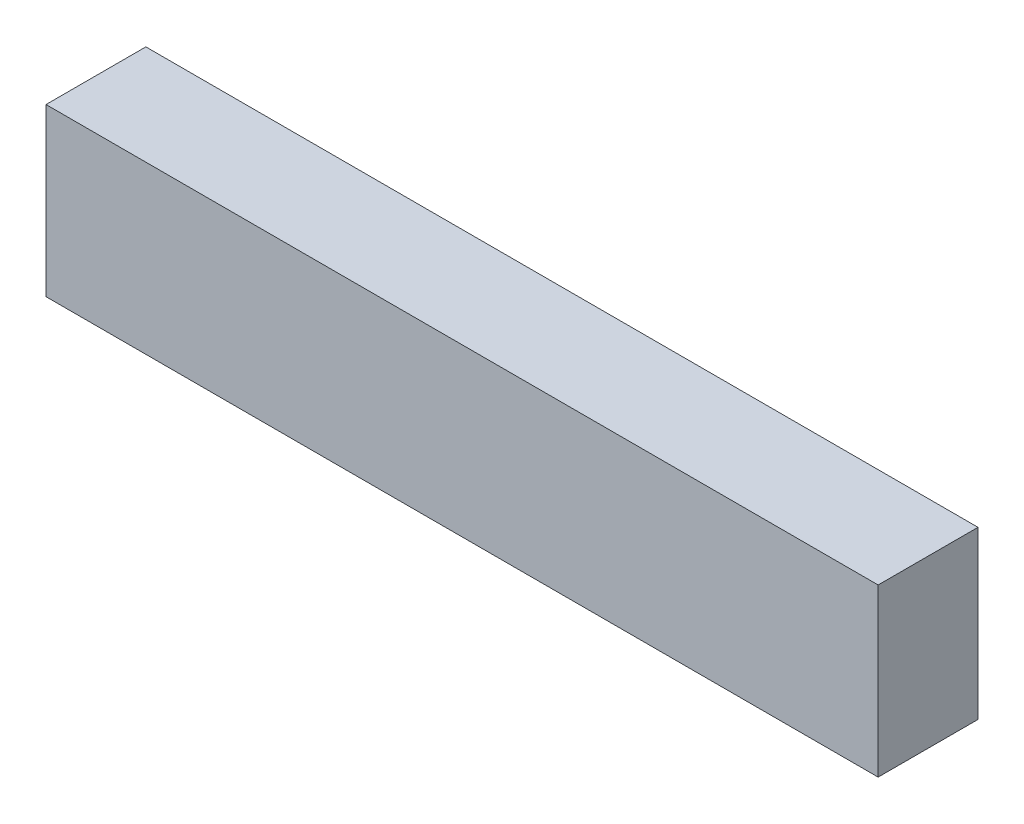
ISO-10303-21;
HEADER;
FILE_DESCRIPTION(('STEP AP214'),'2;1');
FILE_NAME('part.step','',(''),(''),'','','');
FILE_SCHEMA(('AUTOMOTIVE_DESIGN { 1 0 10303 214 1 1 1 1 }'));
ENDSEC;
DATA;
#1=APPLICATION_CONTEXT('core data for automotive mechanical design processes');
#2=APPLICATION_PROTOCOL_DEFINITION('international standard','automotive_design',2000,#1);
#3=PRODUCT_CONTEXT('',#1,'mechanical');
#4=PRODUCT('Part','Part','',(#3));
#5=PRODUCT_RELATED_PRODUCT_CATEGORY('part','',(#4));
#6=PRODUCT_DEFINITION_FORMATION('','',#4);
#7=PRODUCT_DEFINITION_CONTEXT('part definition',#1,'design');
#8=PRODUCT_DEFINITION('design','',#6,#7);
#9=PRODUCT_DEFINITION_SHAPE('','',#8);
#10=(LENGTH_UNIT() NAMED_UNIT(*) SI_UNIT(.MILLI.,.METRE.));
#11=(NAMED_UNIT(*) PLANE_ANGLE_UNIT() SI_UNIT($,.RADIAN.));
#12=(NAMED_UNIT(*) SI_UNIT($,.STERADIAN.) SOLID_ANGLE_UNIT());
#13=UNCERTAINTY_MEASURE_WITH_UNIT(LENGTH_MEASURE(1.E-05),#10,'distance_accuracy_value','');
#14=(GEOMETRIC_REPRESENTATION_CONTEXT(3) GLOBAL_UNCERTAINTY_ASSIGNED_CONTEXT((#13)) GLOBAL_UNIT_ASSIGNED_CONTEXT((#10,
#11,#12)) REPRESENTATION_CONTEXT('',''));
#15=CARTESIAN_POINT('',(0.,0.,0.));
#16=DIRECTION('',(0.,0.,1.));
#17=DIRECTION('',(1.,0.,0.));
#18=AXIS2_PLACEMENT_3D('',#15,#16,#17);
#19=CARTESIAN_POINT('',(0.,0.,6.));
#20=DIRECTION('',(-1.,0.,0.));
#21=DIRECTION('',(0.,0.,1.));
#22=AXIS2_PLACEMENT_3D('',#19,#20,#21);
#23=PLANE('',#22);
#24=DIRECTION('',(0.,1.,0.));
#25=VECTOR('',#24,1.);
#26=CARTESIAN_POINT('',(0.,0.,0.));
#27=LINE('',#26,#25);
#28=CARTESIAN_POINT('',(0.,0.,0.));
#29=VERTEX_POINT('',#28);
#30=CARTESIAN_POINT('',(0.,10.,0.));
#31=VERTEX_POINT('',#30);
#32=EDGE_CURVE('E96',#29,#31,#27,.T.);
#33=ORIENTED_EDGE('',*,*,#32,.T.);
#34=DIRECTION('',(0.,0.,-1.));
#35=VECTOR('',#34,1.);
#36=CARTESIAN_POINT('',(0.,10.,6.));
#37=LINE('',#36,#35);
#38=CARTESIAN_POINT('',(0.,10.,6.));
#39=VERTEX_POINT('',#38);
#40=EDGE_CURVE('E11',#39,#31,#37,.T.);
#41=ORIENTED_EDGE('',*,*,#40,.F.);
#42=DIRECTION('',(0.,1.,0.));
#43=VECTOR('',#42,1.);
#44=CARTESIAN_POINT('',(0.,0.,6.));
#45=LINE('',#44,#43);
#46=CARTESIAN_POINT('',(0.,0.,6.));
#47=VERTEX_POINT('',#46);
#48=EDGE_CURVE('E84',#47,#39,#45,.T.);
#49=ORIENTED_EDGE('',*,*,#48,.F.);
#50=DIRECTION('',(0.,0.,-1.));
#51=VECTOR('',#50,1.);
#52=CARTESIAN_POINT('',(0.,0.,6.));
#53=LINE('',#52,#51);
#54=EDGE_CURVE('E92',#47,#29,#53,.T.);
#55=ORIENTED_EDGE('',*,*,#54,.T.);
#56=EDGE_LOOP('',(#33,#41,#49,#55));
#57=FACE_BOUND('',#56,.T.);
#58=ADVANCED_FACE('F33',(#57),#23,.F.);
#59=CARTESIAN_POINT('',(0.,10.,6.));
#60=DIRECTION('',(0.,-1.,0.));
#61=DIRECTION('',(1.,0.,0.));
#62=AXIS2_PLACEMENT_3D('',#59,#60,#61);
#63=PLANE('',#62);
#64=DIRECTION('',(-1.,0.,0.));
#65=VECTOR('',#64,1.);
#66=CARTESIAN_POINT('',(0.,10.,0.));
#67=LINE('',#66,#65);
#68=CARTESIAN_POINT('',(-50.,10.,0.));
#69=VERTEX_POINT('',#68);
#70=EDGE_CURVE('E88',#31,#69,#67,.T.);
#71=ORIENTED_EDGE('',*,*,#70,.T.);
#72=DIRECTION('',(0.,0.,-1.));
#73=VECTOR('',#72,1.);
#74=CARTESIAN_POINT('',(-50.,10.,6.));
#75=LINE('',#74,#73);
#76=CARTESIAN_POINT('',(-50.,10.,6.));
#77=VERTEX_POINT('',#76);
#78=EDGE_CURVE('E41',#77,#69,#75,.T.);
#79=ORIENTED_EDGE('',*,*,#78,.F.);
#80=DIRECTION('',(-1.,0.,0.));
#81=VECTOR('',#80,1.);
#82=CARTESIAN_POINT('',(0.,10.,6.));
#83=LINE('',#82,#81);
#84=EDGE_CURVE('E79',#39,#77,#83,.T.);
#85=ORIENTED_EDGE('',*,*,#84,.F.);
#86=ORIENTED_EDGE('',*,*,#40,.T.);
#87=EDGE_LOOP('',(#71,#79,#85,#86));
#88=FACE_BOUND('',#87,.T.);
#89=ADVANCED_FACE('F87',(#88),#63,.F.);
#90=CARTESIAN_POINT('',(-50.,0.,6.));
#91=DIRECTION('',(1.,0.,0.));
#92=DIRECTION('',(0.,0.,-1.));
#93=AXIS2_PLACEMENT_3D('',#90,#91,#92);
#94=PLANE('',#93);
#95=DIRECTION('',(0.,-1.,0.));
#96=VECTOR('',#95,1.);
#97=CARTESIAN_POINT('',(-50.,0.,0.));
#98=LINE('',#97,#96);
#99=CARTESIAN_POINT('',(-50.,0.,0.));
#100=VERTEX_POINT('',#99);
#101=EDGE_CURVE('E66',#69,#100,#98,.T.);
#102=ORIENTED_EDGE('',*,*,#101,.T.);
#103=DIRECTION('',(0.,0.,-1.));
#104=VECTOR('',#103,1.);
#105=CARTESIAN_POINT('',(-50.,0.,6.));
#106=LINE('',#105,#104);
#107=CARTESIAN_POINT('',(-50.,0.,6.));
#108=VERTEX_POINT('',#107);
#109=EDGE_CURVE('E89',#108,#100,#106,.T.);
#110=ORIENTED_EDGE('',*,*,#109,.F.);
#111=DIRECTION('',(0.,-1.,0.));
#112=VECTOR('',#111,1.);
#113=CARTESIAN_POINT('',(-50.,0.,6.));
#114=LINE('',#113,#112);
#115=EDGE_CURVE('E82',#77,#108,#114,.T.);
#116=ORIENTED_EDGE('',*,*,#115,.F.);
#117=ORIENTED_EDGE('',*,*,#78,.T.);
#118=EDGE_LOOP('',(#102,#110,#116,#117));
#119=FACE_BOUND('',#118,.T.);
#120=ADVANCED_FACE('F90',(#119),#94,.F.);
#121=CARTESIAN_POINT('',(0.,0.,6.));
#122=DIRECTION('',(0.,1.,0.));
#123=DIRECTION('',(-1.,0.,0.));
#124=AXIS2_PLACEMENT_3D('',#121,#122,#123);
#125=PLANE('',#124);
#126=DIRECTION('',(1.,0.,0.));
#127=VECTOR('',#126,1.);
#128=CARTESIAN_POINT('',(0.,0.,0.));
#129=LINE('',#128,#127);
#130=EDGE_CURVE('E72',#100,#29,#129,.T.);
#131=ORIENTED_EDGE('',*,*,#130,.T.);
#132=ORIENTED_EDGE('',*,*,#54,.F.);
#133=DIRECTION('',(1.,0.,0.));
#134=VECTOR('',#133,1.);
#135=CARTESIAN_POINT('',(0.,0.,6.));
#136=LINE('',#135,#134);
#137=EDGE_CURVE('E49',#108,#47,#136,.T.);
#138=ORIENTED_EDGE('',*,*,#137,.F.);
#139=ORIENTED_EDGE('',*,*,#109,.T.);
#140=EDGE_LOOP('',(#131,#132,#138,#139));
#141=FACE_BOUND('',#140,.T.);
#142=ADVANCED_FACE('F103',(#141),#125,.F.);
#143=CARTESIAN_POINT('',(0.,0.,6.));
#144=DIRECTION('',(0.,0.,1.));
#145=DIRECTION('',(1.,0.,0.));
#146=AXIS2_PLACEMENT_3D('',#143,#144,#145);
#147=PLANE('',#146);
#148=ORIENTED_EDGE('',*,*,#48,.T.);
#149=ORIENTED_EDGE('',*,*,#84,.T.);
#150=ORIENTED_EDGE('',*,*,#115,.T.);
#151=ORIENTED_EDGE('',*,*,#137,.T.);
#152=EDGE_LOOP('',(#148,#149,#150,#151));
#153=FACE_BOUND('',#152,.T.);
#154=ADVANCED_FACE('F80',(#153),#147,.T.);
#155=CARTESIAN_POINT('',(0.,0.,0.));
#156=DIRECTION('',(0.,0.,1.));
#157=DIRECTION('',(1.,0.,0.));
#158=AXIS2_PLACEMENT_3D('',#155,#156,#157);
#159=PLANE('',#158);
#160=ORIENTED_EDGE('',*,*,#32,.F.);
#161=ORIENTED_EDGE('',*,*,#130,.F.);
#162=ORIENTED_EDGE('',*,*,#101,.F.);
#163=ORIENTED_EDGE('',*,*,#70,.F.);
#164=EDGE_LOOP('',(#160,#161,#162,#163));
#165=FACE_BOUND('',#164,.T.);
#166=ADVANCED_FACE('F106',(#165),#159,.F.);
#167=CLOSED_SHELL('',(#58,#89,#120,#142,#154,#166));
#168=MANIFOLD_SOLID_BREP('B2',#167);
#169=ADVANCED_BREP_SHAPE_REPRESENTATION('',(#18,#168),#14);
#170=SHAPE_DEFINITION_REPRESENTATION(#9,#169);
ENDSEC;
END-ISO-10303-21;
